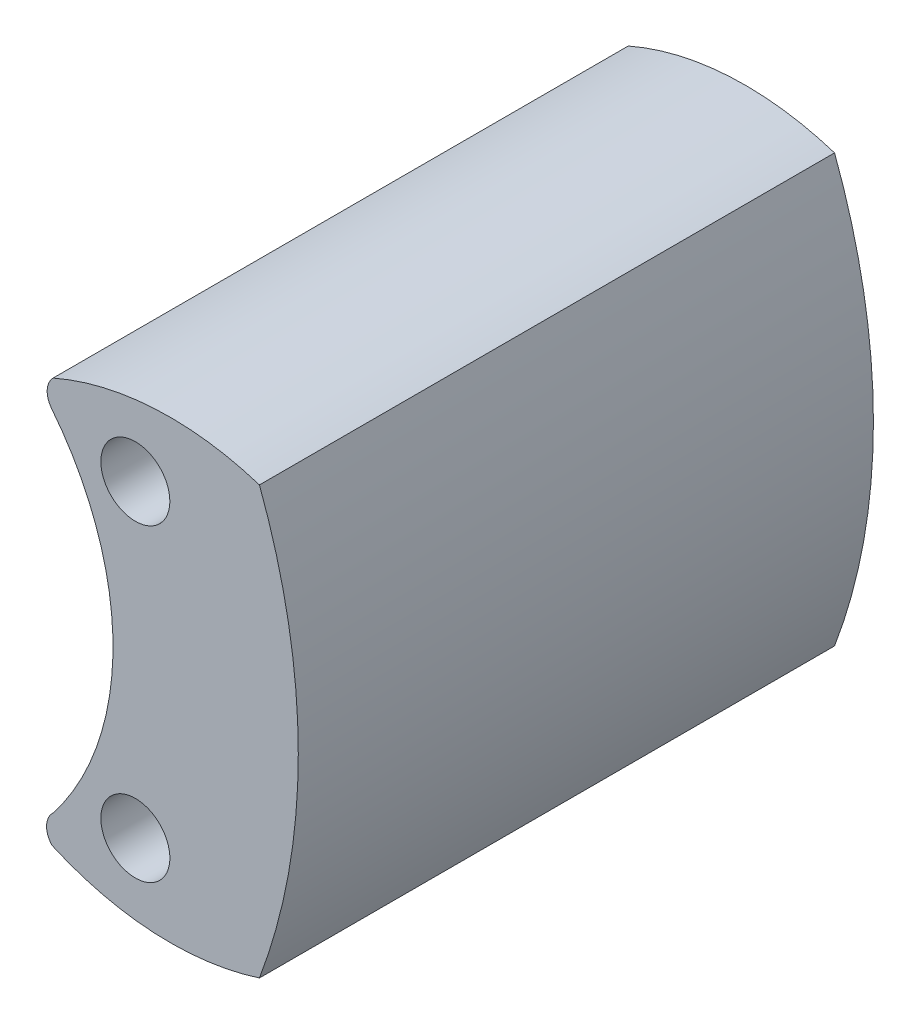
ISO-10303-21;
HEADER;
FILE_DESCRIPTION(('STEP AP214'),'2;1');
FILE_NAME('part.step','',(''),(''),'','','');
FILE_SCHEMA(('AUTOMOTIVE_DESIGN { 1 0 10303 214 1 1 1 1 }'));
ENDSEC;
DATA;
#1=APPLICATION_CONTEXT('core data for automotive mechanical design processes');
#2=APPLICATION_PROTOCOL_DEFINITION('international standard','automotive_design',2000,#1);
#3=PRODUCT_CONTEXT('',#1,'mechanical');
#4=PRODUCT('Part','Part','',(#3));
#5=PRODUCT_RELATED_PRODUCT_CATEGORY('part','',(#4));
#6=PRODUCT_DEFINITION_FORMATION('','',#4);
#7=PRODUCT_DEFINITION_CONTEXT('part definition',#1,'design');
#8=PRODUCT_DEFINITION('design','',#6,#7);
#9=PRODUCT_DEFINITION_SHAPE('','',#8);
#10=(LENGTH_UNIT() NAMED_UNIT(*) SI_UNIT(.MILLI.,.METRE.));
#11=(NAMED_UNIT(*) PLANE_ANGLE_UNIT() SI_UNIT($,.RADIAN.));
#12=(NAMED_UNIT(*) SI_UNIT($,.STERADIAN.) SOLID_ANGLE_UNIT());
#13=UNCERTAINTY_MEASURE_WITH_UNIT(LENGTH_MEASURE(1.E-05),#10,'distance_accuracy_value','');
#14=(GEOMETRIC_REPRESENTATION_CONTEXT(3) GLOBAL_UNCERTAINTY_ASSIGNED_CONTEXT((#13)) GLOBAL_UNIT_ASSIGNED_CONTEXT((#10,
#11,#12)) REPRESENTATION_CONTEXT('',''));
#15=CARTESIAN_POINT('',(0.,0.,0.));
#16=DIRECTION('',(0.,0.,1.));
#17=DIRECTION('',(1.,0.,0.));
#18=AXIS2_PLACEMENT_3D('',#15,#16,#17);
#19=CARTESIAN_POINT('',(1.51645658150854,-2.74018411875687,25.));
#20=DIRECTION('',(0.,0.,-1.));
#21=DIRECTION('',(-1.,0.,0.));
#22=AXIS2_PLACEMENT_3D('',#19,#20,#21);
#23=CYLINDRICAL_SURFACE('',#22,12.6318125052895);
#24=DIRECTION('',(0.,0.,-1.));
#25=VECTOR('',#24,1.);
#26=CARTESIAN_POINT('',(5.39429470920508,9.28167341758802,25.));
#27=LINE('',#26,#25);
#28=CARTESIAN_POINT('',(5.39429470920508,9.28167341758802,25.));
#29=VERTEX_POINT('',#28);
#30=CARTESIAN_POINT('',(5.39429470920508,9.28167341758802,-0.001));
#31=VERTEX_POINT('',#30);
#32=EDGE_CURVE('E275',#29,#31,#27,.T.);
#33=ORIENTED_EDGE('',*,*,#32,.T.);
#34=CARTESIAN_POINT('',(1.51645658150854,-2.74018411875687,-0.001));
#35=DIRECTION('',(0.,0.,1.));
#36=DIRECTION('',(-1.,0.,0.));
#37=AXIS2_PLACEMENT_3D('',#34,#35,#36);
#38=CIRCLE('',#37,12.6318125052895);
#39=CARTESIAN_POINT('',(-3.57576767996249,8.81974404882597,-0.001));
#40=VERTEX_POINT('',#39);
#41=EDGE_CURVE('E245',#31,#40,#38,.T.);
#42=ORIENTED_EDGE('',*,*,#41,.T.);
#43=DIRECTION('',(0.,0.,-1.));
#44=VECTOR('',#43,1.);
#45=CARTESIAN_POINT('',(-3.57576767996249,8.81974404882597,25.));
#46=LINE('',#45,#44);
#47=CARTESIAN_POINT('',(-3.57576767996249,8.81974404882597,25.));
#48=VERTEX_POINT('',#47);
#49=EDGE_CURVE('E161',#48,#40,#46,.T.);
#50=ORIENTED_EDGE('',*,*,#49,.F.);
#51=CARTESIAN_POINT('',(1.51645658150854,-2.74018411875687,25.));
#52=DIRECTION('',(0.,0.,1.));
#53=DIRECTION('',(-1.,0.,0.));
#54=AXIS2_PLACEMENT_3D('',#51,#52,#53);
#55=CIRCLE('',#54,12.6318125052895);
#56=EDGE_CURVE('E264',#29,#48,#55,.T.);
#57=ORIENTED_EDGE('',*,*,#56,.F.);
#58=EDGE_LOOP('',(#33,#42,#50,#57));
#59=FACE_BOUND('',#58,.T.);
#60=ADVANCED_FACE('F154',(#59),#23,.T.);
#61=CARTESIAN_POINT('',(-2.93942531431104,8.19213389498871,25.));
#62=DIRECTION('',(0.,0.,-1.));
#63=DIRECTION('',(-1.,0.,0.));
#64=AXIS2_PLACEMENT_3D('',#61,#62,#63);
#65=CYLINDRICAL_SURFACE('',#64,0.893770726485547);
#66=ORIENTED_EDGE('',*,*,#49,.T.);
#67=CARTESIAN_POINT('',(-2.93942531431104,8.19213389498871,-0.001));
#68=DIRECTION('',(0.,0.,1.));
#69=DIRECTION('',(-1.,0.,0.));
#70=AXIS2_PLACEMENT_3D('',#67,#68,#69);
#71=CIRCLE('',#70,0.893770726485547);
#72=CARTESIAN_POINT('',(-3.63871286599695,7.63551640372596,-0.001));
#73=VERTEX_POINT('',#72);
#74=EDGE_CURVE('E250',#40,#73,#71,.T.);
#75=ORIENTED_EDGE('',*,*,#74,.T.);
#76=DIRECTION('',(0.,0.,-1.));
#77=VECTOR('',#76,1.);
#78=CARTESIAN_POINT('',(-3.63871286599695,7.63551640372596,25.));
#79=LINE('',#78,#77);
#80=CARTESIAN_POINT('',(-3.63871286599695,7.63551640372596,25.));
#81=VERTEX_POINT('',#80);
#82=EDGE_CURVE('E284',#81,#73,#79,.T.);
#83=ORIENTED_EDGE('',*,*,#82,.F.);
#84=CARTESIAN_POINT('',(-2.93942531431104,8.19213389498871,25.));
#85=DIRECTION('',(0.,0.,1.));
#86=DIRECTION('',(-1.,0.,0.));
#87=AXIS2_PLACEMENT_3D('',#84,#85,#86);
#88=CIRCLE('',#87,0.893770726485547);
#89=EDGE_CURVE('E266',#48,#81,#88,.T.);
#90=ORIENTED_EDGE('',*,*,#89,.F.);
#91=EDGE_LOOP('',(#66,#75,#83,#90));
#92=FACE_BOUND('',#91,.T.);
#93=ADVANCED_FACE('F288',(#92),#65,.T.);
#94=CARTESIAN_POINT('',(-13.2313355478784,0.,25.));
#95=DIRECTION('',(0.,0.,-1.));
#96=DIRECTION('',(-1.,0.,0.));
#97=AXIS2_PLACEMENT_3D('',#94,#95,#96);
#98=CYLINDRICAL_SURFACE('',#97,12.2604861513936);
#99=CARTESIAN_POINT('',(-13.2313355478784,0.,23.999));
#100=DIRECTION('',(0.,0.,-1.));
#101=DIRECTION('',(-1.,0.,0.));
#102=AXIS2_PLACEMENT_3D('',#99,#100,#101);
#103=CIRCLE('',#102,12.2604861513936);
#104=CARTESIAN_POINT('',(-1.64537225114125,-4.01060782864323,23.999));
#105=VERTEX_POINT('',#104);
#106=CARTESIAN_POINT('',(-1.64537225114125,4.01060782864323,23.999));
#107=VERTEX_POINT('',#106);
#108=EDGE_CURVE('E12',#105,#107,#103,.F.);
#109=ORIENTED_EDGE('',*,*,#108,.F.);
#110=DIRECTION('',(0.,0.,-1.));
#111=VECTOR('',#110,1.);
#112=CARTESIAN_POINT('',(-1.64537225114125,-4.01060782864323,11.999));
#113=LINE('',#112,#111);
#114=CARTESIAN_POINT('',(-1.64537225114125,-4.01060782864323,-0.001));
#115=VERTEX_POINT('',#114);
#116=EDGE_CURVE('E224',#105,#115,#113,.T.);
#117=ORIENTED_EDGE('',*,*,#116,.T.);
#118=CARTESIAN_POINT('',(-13.2313355478784,0.,-0.001));
#119=DIRECTION('',(0.,0.,-1.));
#120=DIRECTION('',(-1.,0.,0.));
#121=AXIS2_PLACEMENT_3D('',#118,#119,#120);
#122=CIRCLE('',#121,12.2604861513936);
#123=CARTESIAN_POINT('',(-3.57576767996249,-7.55576136577806,-0.001));
#124=VERTEX_POINT('',#123);
#125=EDGE_CURVE('E253',#115,#124,#122,.T.);
#126=ORIENTED_EDGE('',*,*,#125,.T.);
#127=DIRECTION('',(0.,0.,-1.));
#128=VECTOR('',#127,1.);
#129=CARTESIAN_POINT('',(-3.57576767996249,-7.55576136577806,25.));
#130=LINE('',#129,#128);
#131=CARTESIAN_POINT('',(-3.57576767996249,-7.55576136577806,25.));
#132=VERTEX_POINT('',#131);
#133=EDGE_CURVE('E281',#132,#124,#130,.T.);
#134=ORIENTED_EDGE('',*,*,#133,.F.);
#135=CARTESIAN_POINT('',(-13.2313355478784,0.,25.));
#136=DIRECTION('',(0.,0.,-1.));
#137=DIRECTION('',(-1.,0.,0.));
#138=AXIS2_PLACEMENT_3D('',#135,#136,#137);
#139=CIRCLE('',#138,12.2604861513936);
#140=EDGE_CURVE('E268',#81,#132,#139,.T.);
#141=ORIENTED_EDGE('',*,*,#140,.F.);
#142=ORIENTED_EDGE('',*,*,#82,.T.);
#143=CARTESIAN_POINT('',(-1.64537225114125,4.01060782864323,-0.00100000000000088));
#144=VERTEX_POINT('',#143);
#145=EDGE_CURVE('E230',#73,#144,#122,.T.);
#146=ORIENTED_EDGE('',*,*,#145,.T.);
#147=DIRECTION('',(0.,0.,-1.));
#148=VECTOR('',#147,1.);
#149=CARTESIAN_POINT('',(-1.64537225114125,4.01060782864323,11.999));
#150=LINE('',#149,#148);
#151=EDGE_CURVE('E168',#144,#107,#150,.F.);
#152=ORIENTED_EDGE('',*,*,#151,.T.);
#153=EDGE_LOOP('',(#109,#117,#126,#134,#141,#142,#146,#152));
#154=FACE_BOUND('',#153,.T.);
#155=ADVANCED_FACE('F228',(#154),#98,.F.);
#156=CARTESIAN_POINT('',(-2.97974763085371,-8.20163469798779,25.));
#157=DIRECTION('',(0.,0.,-1.));
#158=DIRECTION('',(-1.,0.,0.));
#159=AXIS2_PLACEMENT_3D('',#156,#157,#158);
#160=CYLINDRICAL_SURFACE('',#159,0.878858498393984);
#161=ORIENTED_EDGE('',*,*,#133,.T.);
#162=CARTESIAN_POINT('',(-2.97974763085371,-8.20163469798779,-0.001));
#163=DIRECTION('',(0.,0.,1.));
#164=DIRECTION('',(1.,0.,0.));
#165=AXIS2_PLACEMENT_3D('',#162,#163,#164);
#166=CIRCLE('',#165,0.878858498393984);
#167=CARTESIAN_POINT('',(-3.62562096306344,-8.79765474709655,-0.001));
#168=VERTEX_POINT('',#167);
#169=EDGE_CURVE('E255',#124,#168,#166,.T.);
#170=ORIENTED_EDGE('',*,*,#169,.T.);
#171=DIRECTION('',(0.,0.,-1.));
#172=VECTOR('',#171,1.);
#173=CARTESIAN_POINT('',(-3.62562096306344,-8.79765474709655,25.));
#174=LINE('',#173,#172);
#175=CARTESIAN_POINT('',(-3.62562096306344,-8.79765474709655,25.));
#176=VERTEX_POINT('',#175);
#177=EDGE_CURVE('E279',#176,#168,#174,.T.);
#178=ORIENTED_EDGE('',*,*,#177,.F.);
#179=CARTESIAN_POINT('',(-2.97974763085371,-8.20163469798779,25.));
#180=DIRECTION('',(0.,0.,1.));
#181=DIRECTION('',(1.,0.,0.));
#182=AXIS2_PLACEMENT_3D('',#179,#180,#181);
#183=CIRCLE('',#182,0.878858498393984);
#184=EDGE_CURVE('E270',#132,#176,#183,.T.);
#185=ORIENTED_EDGE('',*,*,#184,.F.);
#186=EDGE_LOOP('',(#161,#170,#178,#185));
#187=FACE_BOUND('',#186,.T.);
#188=ADVANCED_FACE('F306',(#187),#160,.T.);
#189=CARTESIAN_POINT('',(1.51645658150854,2.74018411875671,25.));
#190=DIRECTION('',(0.,0.,-1.));
#191=DIRECTION('',(-1.,0.,0.));
#192=AXIS2_PLACEMENT_3D('',#189,#190,#191);
#193=CYLINDRICAL_SURFACE('',#192,12.6318125052894);
#194=ORIENTED_EDGE('',*,*,#177,.T.);
#195=CARTESIAN_POINT('',(1.51645658150854,2.74018411875671,-0.001));
#196=DIRECTION('',(0.,0.,1.));
#197=DIRECTION('',(1.,0.,0.));
#198=AXIS2_PLACEMENT_3D('',#195,#196,#197);
#199=CIRCLE('',#198,12.6318125052894);
#200=CARTESIAN_POINT('',(5.39429470920509,-9.28167341758802,-0.001));
#201=VERTEX_POINT('',#200);
#202=EDGE_CURVE('E258',#168,#201,#199,.T.);
#203=ORIENTED_EDGE('',*,*,#202,.T.);
#204=DIRECTION('',(0.,0.,-1.));
#205=VECTOR('',#204,1.);
#206=CARTESIAN_POINT('',(5.39429470920509,-9.28167341758802,25.));
#207=LINE('',#206,#205);
#208=CARTESIAN_POINT('',(5.39429470920509,-9.28167341758802,25.));
#209=VERTEX_POINT('',#208);
#210=EDGE_CURVE('E277',#209,#201,#207,.T.);
#211=ORIENTED_EDGE('',*,*,#210,.F.);
#212=CARTESIAN_POINT('',(1.51645658150854,2.74018411875671,25.));
#213=DIRECTION('',(0.,0.,1.));
#214=DIRECTION('',(1.,0.,0.));
#215=AXIS2_PLACEMENT_3D('',#212,#213,#214);
#216=CIRCLE('',#215,12.6318125052894);
#217=EDGE_CURVE('E272',#176,#209,#216,.T.);
#218=ORIENTED_EDGE('',*,*,#217,.F.);
#219=EDGE_LOOP('',(#194,#203,#211,#218));
#220=FACE_BOUND('',#219,.T.);
#221=ADVANCED_FACE('F312',(#220),#193,.T.);
#222=CARTESIAN_POINT('',(-19.2656664170293,0.,25.));
#223=DIRECTION('',(0.,0.,-1.));
#224=DIRECTION('',(-1.,0.,0.));
#225=AXIS2_PLACEMENT_3D('',#222,#223,#224);
#226=CYLINDRICAL_SURFACE('',#225,26.3488736794981);
#227=ORIENTED_EDGE('',*,*,#210,.T.);
#228=CARTESIAN_POINT('',(-19.2656664170293,0.,-0.001));
#229=DIRECTION('',(0.,0.,1.));
#230=DIRECTION('',(-1.,0.,0.));
#231=AXIS2_PLACEMENT_3D('',#228,#229,#230);
#232=CIRCLE('',#231,26.3488736794981);
#233=EDGE_CURVE('E261',#201,#31,#232,.T.);
#234=ORIENTED_EDGE('',*,*,#233,.T.);
#235=ORIENTED_EDGE('',*,*,#32,.F.);
#236=CARTESIAN_POINT('',(-19.2656664170293,0.,25.));
#237=DIRECTION('',(0.,0.,1.));
#238=DIRECTION('',(-1.,0.,0.));
#239=AXIS2_PLACEMENT_3D('',#236,#237,#238);
#240=CIRCLE('',#239,26.3488736794981);
#241=EDGE_CURVE('E176',#209,#29,#240,.T.);
#242=ORIENTED_EDGE('',*,*,#241,.F.);
#243=EDGE_LOOP('',(#227,#234,#235,#242));
#244=FACE_BOUND('',#243,.T.);
#245=ADVANCED_FACE('F298',(#244),#226,.T.);
#246=CARTESIAN_POINT('',(-8.87460491776037,-1.37009205937844,25.));
#247=DIRECTION('',(0.,0.,-1.));
#248=DIRECTION('',(-1.,0.,0.));
#249=AXIS2_PLACEMENT_3D('',#246,#247,#248);
#250=PLANE('',#249);
#251=CARTESIAN_POINT('',(0.,-6.715,25.));
#252=DIRECTION('',(0.,0.,1.));
#253=DIRECTION('',(-1.,0.,0.));
#254=AXIS2_PLACEMENT_3D('',#251,#252,#253);
#255=CIRCLE('',#254,1.5);
#256=CARTESIAN_POINT('',(-1.5,-6.715,25.));
#257=VERTEX_POINT('',#256);
#258=EDGE_CURVE('E232',#257,#257,#255,.T.);
#259=ORIENTED_EDGE('',*,*,#258,.F.);
#260=EDGE_LOOP('',(#259));
#261=FACE_BOUND('',#260,.T.);
#262=CARTESIAN_POINT('',(0.,6.715,25.));
#263=DIRECTION('',(0.,0.,1.));
#264=DIRECTION('',(1.,0.,0.));
#265=AXIS2_PLACEMENT_3D('',#262,#263,#264);
#266=CIRCLE('',#265,1.5);
#267=CARTESIAN_POINT('',(1.5,6.715,25.));
#268=VERTEX_POINT('',#267);
#269=EDGE_CURVE('E239',#268,#268,#266,.T.);
#270=ORIENTED_EDGE('',*,*,#269,.F.);
#271=EDGE_LOOP('',(#270));
#272=FACE_BOUND('',#271,.T.);
#273=ORIENTED_EDGE('',*,*,#56,.T.);
#274=ORIENTED_EDGE('',*,*,#89,.T.);
#275=ORIENTED_EDGE('',*,*,#140,.T.);
#276=ORIENTED_EDGE('',*,*,#184,.T.);
#277=ORIENTED_EDGE('',*,*,#217,.T.);
#278=ORIENTED_EDGE('',*,*,#241,.T.);
#279=EDGE_LOOP('',(#273,#274,#275,#276,#277,#278));
#280=FACE_BOUND('',#279,.T.);
#281=ADVANCED_FACE('F311',(#261,#272,#280),#250,.F.);
#282=CARTESIAN_POINT('',(-8.87460491776037,-1.37009205937844,-0.001));
#283=DIRECTION('',(0.,0.,-1.));
#284=DIRECTION('',(-1.,0.,0.));
#285=AXIS2_PLACEMENT_3D('',#282,#283,#284);
#286=PLANE('',#285);
#287=CARTESIAN_POINT('',(0.,0.,-0.001));
#288=DIRECTION('',(0.,0.,-1.));
#289=DIRECTION('',(-1.,0.,0.));
#290=AXIS2_PLACEMENT_3D('',#287,#288,#289);
#291=CIRCLE('',#290,4.335);
#292=EDGE_CURVE('E225',#144,#115,#291,.T.);
#293=ORIENTED_EDGE('',*,*,#292,.F.);
#294=ORIENTED_EDGE('',*,*,#145,.F.);
#295=ORIENTED_EDGE('',*,*,#74,.F.);
#296=ORIENTED_EDGE('',*,*,#41,.F.);
#297=ORIENTED_EDGE('',*,*,#233,.F.);
#298=ORIENTED_EDGE('',*,*,#202,.F.);
#299=ORIENTED_EDGE('',*,*,#169,.F.);
#300=ORIENTED_EDGE('',*,*,#125,.F.);
#301=EDGE_LOOP('',(#293,#294,#295,#296,#297,#298,#299,#300));
#302=FACE_BOUND('',#301,.T.);
#303=CARTESIAN_POINT('',(0.,-6.715,-0.001000000000001));
#304=DIRECTION('',(0.,0.,1.));
#305=DIRECTION('',(-1.,0.,0.));
#306=AXIS2_PLACEMENT_3D('',#303,#304,#305);
#307=CIRCLE('',#306,1.5);
#308=CARTESIAN_POINT('',(-1.5,-6.715,-0.001000000000001));
#309=VERTEX_POINT('',#308);
#310=EDGE_CURVE('E236',#309,#309,#307,.T.);
#311=ORIENTED_EDGE('',*,*,#310,.T.);
#312=EDGE_LOOP('',(#311));
#313=FACE_BOUND('',#312,.T.);
#314=CARTESIAN_POINT('',(0.,6.715,-0.001000000000001));
#315=DIRECTION('',(0.,0.,1.));
#316=DIRECTION('',(1.,0.,0.));
#317=AXIS2_PLACEMENT_3D('',#314,#315,#316);
#318=CIRCLE('',#317,1.5);
#319=CARTESIAN_POINT('',(1.5,6.715,-0.001000000000001));
#320=VERTEX_POINT('',#319);
#321=EDGE_CURVE('E242',#320,#320,#318,.T.);
#322=ORIENTED_EDGE('',*,*,#321,.T.);
#323=EDGE_LOOP('',(#322));
#324=FACE_BOUND('',#323,.T.);
#325=ADVANCED_FACE('F294',(#302,#313,#324),#286,.T.);
#326=CARTESIAN_POINT('',(0.,6.715,-0.001000000000001));
#327=DIRECTION('',(0.,0.,1.));
#328=DIRECTION('',(1.,0.,0.));
#329=AXIS2_PLACEMENT_3D('',#326,#327,#328);
#330=CYLINDRICAL_SURFACE('',#329,1.5);
#331=ORIENTED_EDGE('',*,*,#321,.F.);
#332=EDGE_LOOP('',(#331));
#333=FACE_BOUND('',#332,.T.);
#334=ORIENTED_EDGE('',*,*,#269,.T.);
#335=EDGE_LOOP('',(#334));
#336=FACE_BOUND('',#335,.T.);
#337=ADVANCED_FACE('F365',(#333,#336),#330,.F.);
#338=CARTESIAN_POINT('',(0.,-6.715,-0.001000000000001));
#339=DIRECTION('',(0.,0.,1.));
#340=DIRECTION('',(1.,0.,0.));
#341=AXIS2_PLACEMENT_3D('',#338,#339,#340);
#342=CYLINDRICAL_SURFACE('',#341,1.5);
#343=ORIENTED_EDGE('',*,*,#310,.F.);
#344=EDGE_LOOP('',(#343));
#345=FACE_BOUND('',#344,.T.);
#346=ORIENTED_EDGE('',*,*,#258,.T.);
#347=EDGE_LOOP('',(#346));
#348=FACE_BOUND('',#347,.T.);
#349=ADVANCED_FACE('F373',(#345,#348),#342,.F.);
#350=CARTESIAN_POINT('',(0.,0.,23.999));
#351=DIRECTION('',(0.,0.,-1.));
#352=DIRECTION('',(-1.,0.,0.));
#353=AXIS2_PLACEMENT_3D('',#350,#351,#352);
#354=PLANE('',#353);
#355=ORIENTED_EDGE('',*,*,#108,.T.);
#356=CARTESIAN_POINT('',(0.,0.,23.999));
#357=DIRECTION('',(0.,0.,-1.));
#358=DIRECTION('',(-1.,0.,0.));
#359=AXIS2_PLACEMENT_3D('',#356,#357,#358);
#360=CIRCLE('',#359,4.335);
#361=EDGE_CURVE('E220',#107,#105,#360,.T.);
#362=ORIENTED_EDGE('',*,*,#361,.T.);
#363=EDGE_LOOP('',(#355,#362));
#364=FACE_BOUND('',#363,.T.);
#365=ADVANCED_FACE('F219',(#364),#354,.T.);
#366=CARTESIAN_POINT('',(0.,0.,23.999));
#367=DIRECTION('',(0.,0.,-1.));
#368=DIRECTION('',(-1.,0.,0.));
#369=AXIS2_PLACEMENT_3D('',#366,#367,#368);
#370=CYLINDRICAL_SURFACE('',#369,4.335);
#371=ORIENTED_EDGE('',*,*,#361,.F.);
#372=ORIENTED_EDGE('',*,*,#151,.F.);
#373=ORIENTED_EDGE('',*,*,#292,.T.);
#374=ORIENTED_EDGE('',*,*,#116,.F.);
#375=EDGE_LOOP('',(#371,#372,#373,#374));
#376=FACE_BOUND('',#375,.T.);
#377=ADVANCED_FACE('F223',(#376),#370,.F.);
#378=CLOSED_SHELL('',(#60,#93,#155,#188,#221,#245,#281,#325,#337,#349,#365,#377));
#379=MANIFOLD_SOLID_BREP('B2',#378);
#380=ADVANCED_BREP_SHAPE_REPRESENTATION('',(#18,#379),#14);
#381=SHAPE_DEFINITION_REPRESENTATION(#9,#380);
ENDSEC;
END-ISO-10303-21;
